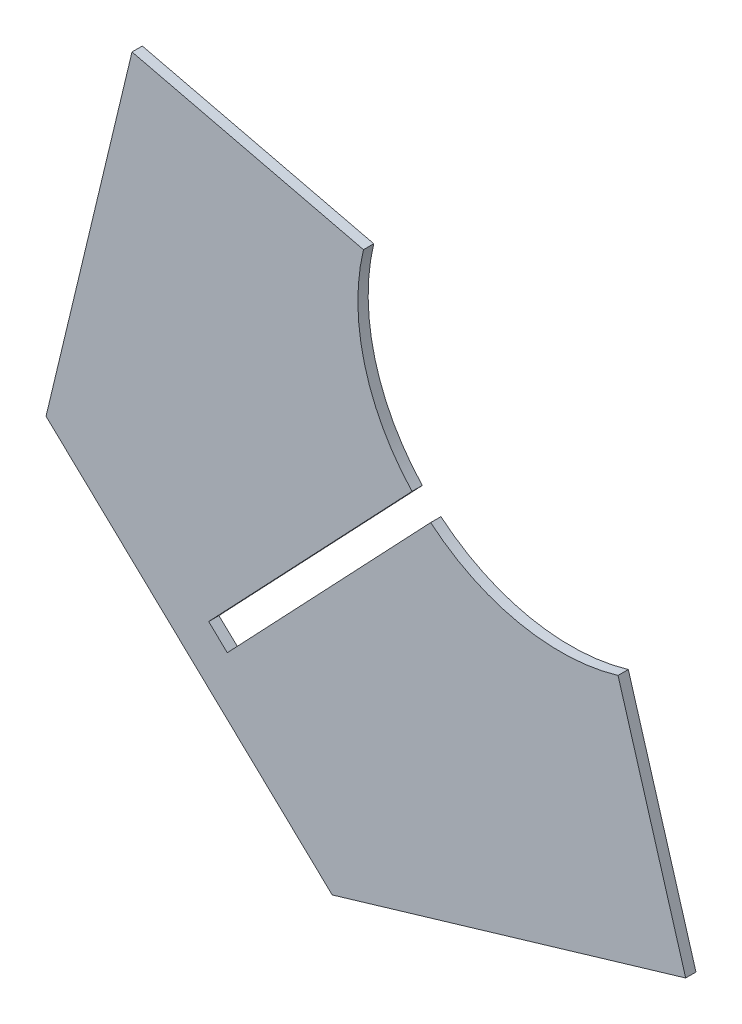
ISO-10303-21;
HEADER;
FILE_DESCRIPTION(('STEP AP214'),'2;1');
FILE_NAME('part.step','',(''),(''),'','','');
FILE_SCHEMA(('AUTOMOTIVE_DESIGN { 1 0 10303 214 1 1 1 1 }'));
ENDSEC;
DATA;
#1=APPLICATION_CONTEXT('core data for automotive mechanical design processes');
#2=APPLICATION_PROTOCOL_DEFINITION('international standard','automotive_design',2000,#1);
#3=PRODUCT_CONTEXT('',#1,'mechanical');
#4=PRODUCT('Part','Part','',(#3));
#5=PRODUCT_RELATED_PRODUCT_CATEGORY('part','',(#4));
#6=PRODUCT_DEFINITION_FORMATION('','',#4);
#7=PRODUCT_DEFINITION_CONTEXT('part definition',#1,'design');
#8=PRODUCT_DEFINITION('design','',#6,#7);
#9=PRODUCT_DEFINITION_SHAPE('','',#8);
#10=(LENGTH_UNIT() NAMED_UNIT(*) SI_UNIT(.MILLI.,.METRE.));
#11=(NAMED_UNIT(*) PLANE_ANGLE_UNIT() SI_UNIT($,.RADIAN.));
#12=(NAMED_UNIT(*) SI_UNIT($,.STERADIAN.) SOLID_ANGLE_UNIT());
#13=UNCERTAINTY_MEASURE_WITH_UNIT(LENGTH_MEASURE(1.E-05),#10,'distance_accuracy_value','');
#14=(GEOMETRIC_REPRESENTATION_CONTEXT(3) GLOBAL_UNCERTAINTY_ASSIGNED_CONTEXT((#13)) GLOBAL_UNIT_ASSIGNED_CONTEXT((#10,
#11,#12)) REPRESENTATION_CONTEXT('',''));
#15=CARTESIAN_POINT('',(0.,0.,0.));
#16=DIRECTION('',(0.,0.,1.));
#17=DIRECTION('',(1.,0.,0.));
#18=AXIS2_PLACEMENT_3D('',#15,#16,#17);
#19=CARTESIAN_POINT('',(-0.219099818656127,-0.230998005209927,-4.));
#20=DIRECTION('',(0.,0.,1.));
#21=DIRECTION('',(1.,0.,0.));
#22=AXIS2_PLACEMENT_3D('',#19,#20,#21);
#23=CYLINDRICAL_SURFACE('',#22,78.8403296338645);
#24=CARTESIAN_POINT('',(-0.219099818656127,-0.230998005209927,0.));
#25=DIRECTION('',(0.,0.,-1.));
#26=DIRECTION('',(-1.,0.,0.));
#27=AXIS2_PLACEMENT_3D('',#24,#25,#26);
#28=CIRCLE('',#27,78.8403296338645);
#29=CARTESIAN_POINT('',(22.1915535452838,-75.8190935796967,0.));
#30=VERTEX_POINT('',#29);
#31=CARTESIAN_POINT('',(-50.7380380628692,-60.7589622486388,0.));
#32=VERTEX_POINT('',#31);
#33=EDGE_CURVE('E143',#30,#32,#28,.T.);
#34=ORIENTED_EDGE('',*,*,#33,.F.);
#35=DIRECTION('',(0.,0.,1.));
#36=VECTOR('',#35,1.);
#37=CARTESIAN_POINT('',(22.1915535452838,-75.8190935796967,-4.));
#38=LINE('',#37,#36);
#39=CARTESIAN_POINT('',(22.1915535452838,-75.8190935796967,-4.));
#40=VERTEX_POINT('',#39);
#41=EDGE_CURVE('E11',#40,#30,#38,.T.);
#42=ORIENTED_EDGE('',*,*,#41,.F.);
#43=CARTESIAN_POINT('',(-0.219099818656127,-0.230998005209927,-4.));
#44=DIRECTION('',(0.,0.,-1.));
#45=DIRECTION('',(-1.,0.,0.));
#46=AXIS2_PLACEMENT_3D('',#43,#44,#45);
#47=CIRCLE('',#46,78.8403296338645);
#48=CARTESIAN_POINT('',(-50.7380380628692,-60.7589622486388,-4.));
#49=VERTEX_POINT('',#48);
#50=EDGE_CURVE('E164',#40,#49,#47,.T.);
#51=ORIENTED_EDGE('',*,*,#50,.T.);
#52=DIRECTION('',(0.,0.,1.));
#53=VECTOR('',#52,1.);
#54=CARTESIAN_POINT('',(-50.7380380628692,-60.7589622486388,-4.));
#55=LINE('',#54,#53);
#56=EDGE_CURVE('E37',#49,#32,#55,.T.);
#57=ORIENTED_EDGE('',*,*,#56,.T.);
#58=EDGE_LOOP('',(#34,#42,#51,#57));
#59=FACE_BOUND('',#58,.T.);
#60=ADVANCED_FACE('F34',(#59),#23,.F.);
#61=CARTESIAN_POINT('',(22.1915535452838,-75.8190935796967,-4.));
#62=DIRECTION('',(0.958749106269834,0.284253674077916,0.));
#63=DIRECTION('',(-0.284253674077916,0.958749106269834,0.));
#64=AXIS2_PLACEMENT_3D('',#61,#62,#63);
#65=PLANE('',#64);
#66=DIRECTION('',(-0.284253674077916,0.958749106269834,0.));
#67=VECTOR('',#66,1.);
#68=CARTESIAN_POINT('',(22.1915535452838,-75.8190935796967,0.));
#69=LINE('',#68,#67);
#70=CARTESIAN_POINT('',(48.52273894971,-164.630612218499,0.));
#71=VERTEX_POINT('',#70);
#72=EDGE_CURVE('E162',#71,#30,#69,.T.);
#73=ORIENTED_EDGE('',*,*,#72,.F.);
#74=DIRECTION('',(0.,0.,1.));
#75=VECTOR('',#74,1.);
#76=CARTESIAN_POINT('',(48.52273894971,-164.630612218499,-4.));
#77=LINE('',#76,#75);
#78=CARTESIAN_POINT('',(48.52273894971,-164.630612218499,-4.));
#79=VERTEX_POINT('',#78);
#80=EDGE_CURVE('E42',#79,#71,#77,.T.);
#81=ORIENTED_EDGE('',*,*,#80,.F.);
#82=DIRECTION('',(-0.284253674077916,0.958749106269834,0.));
#83=VECTOR('',#82,1.);
#84=CARTESIAN_POINT('',(22.1915535452838,-75.8190935796967,-4.));
#85=LINE('',#84,#83);
#86=EDGE_CURVE('E141',#79,#40,#85,.T.);
#87=ORIENTED_EDGE('',*,*,#86,.T.);
#88=ORIENTED_EDGE('',*,*,#41,.T.);
#89=EDGE_LOOP('',(#73,#81,#87,#88));
#90=FACE_BOUND('',#89,.T.);
#91=ADVANCED_FACE('F180',(#90),#65,.T.);
#92=CARTESIAN_POINT('',(-252.479191453199,-50.4016684066715,-4.));
#93=DIRECTION('',(-0.688174244846349,-0.72554545600545,0.));
#94=DIRECTION('',(0.72554545600545,-0.688174244846349,0.));
#95=AXIS2_PLACEMENT_3D('',#92,#93,#94);
#96=PLANE('',#95);
#97=DIRECTION('',(0.,0.,1.));
#98=VECTOR('',#97,1.);
#99=CARTESIAN_POINT('',(-89.0454024574619,-205.417351288536,-10.));
#100=LINE('',#99,#98);
#101=CARTESIAN_POINT('',(-89.0454024574619,-205.417351288536,-4.));
#102=VERTEX_POINT('',#101);
#103=CARTESIAN_POINT('',(-89.0454024574619,-205.417351288536,0.));
#104=VERTEX_POINT('',#103);
#105=EDGE_CURVE('E197',#102,#104,#100,.T.);
#106=ORIENTED_EDGE('',*,*,#105,.T.);
#107=DIRECTION('',(0.72554545600545,-0.688174244846349,0.));
#108=VECTOR('',#107,1.);
#109=CARTESIAN_POINT('',(-252.479191453199,-50.4016684066715,0.));
#110=LINE('',#109,#108);
#111=CARTESIAN_POINT('',(-200.425980015317,-99.7737362441728,0.));
#112=VERTEX_POINT('',#111);
#113=EDGE_CURVE('E159',#112,#104,#110,.T.);
#114=ORIENTED_EDGE('',*,*,#113,.F.);
#115=DIRECTION('',(0.,0.,1.));
#116=VECTOR('',#115,1.);
#117=CARTESIAN_POINT('',(-200.425980015317,-99.7737362441729,-10.));
#118=LINE('',#117,#116);
#119=CARTESIAN_POINT('',(-200.425980015317,-99.7737362441729,-4.));
#120=VERTEX_POINT('',#119);
#121=EDGE_CURVE('E50',#120,#112,#118,.T.);
#122=ORIENTED_EDGE('',*,*,#121,.F.);
#123=DIRECTION('',(0.72554545600545,-0.688174244846349,0.));
#124=VECTOR('',#123,1.);
#125=CARTESIAN_POINT('',(-252.479191453199,-50.4016684066715,-4.));
#126=LINE('',#125,#124);
#127=EDGE_CURVE('E138',#120,#102,#126,.T.);
#128=ORIENTED_EDGE('',*,*,#127,.T.);
#129=EDGE_LOOP('',(#106,#114,#122,#128));
#130=FACE_BOUND('',#129,.T.);
#131=ADVANCED_FACE('F205',(#130),#96,.T.);
#132=CARTESIAN_POINT('',(-76.8856374918177,18.1548546534546,-4.));
#133=DIRECTION('',(0.233203650264384,0.97242791892426,0.));
#134=DIRECTION('',(-0.97242791892426,0.233203650264384,0.));
#135=AXIS2_PLACEMENT_3D('',#132,#133,#134);
#136=PLANE('',#135);
#137=DIRECTION('',(-0.97242791892426,0.233203650264384,0.));
#138=VECTOR('',#137,1.);
#139=CARTESIAN_POINT('',(-76.8856374918177,18.1548546534546,0.));
#140=LINE('',#139,#138);
#141=CARTESIAN_POINT('',(-76.8856374918177,18.1548546534546,0.));
#142=VERTEX_POINT('',#141);
#143=CARTESIAN_POINT('',(-166.96426148391,39.7571385008654,0.));
#144=VERTEX_POINT('',#143);
#145=EDGE_CURVE('E156',#142,#144,#140,.T.);
#146=ORIENTED_EDGE('',*,*,#145,.F.);
#147=DIRECTION('',(0.,0.,1.));
#148=VECTOR('',#147,1.);
#149=CARTESIAN_POINT('',(-76.8856374918177,18.1548546534546,-4.));
#150=LINE('',#149,#148);
#151=CARTESIAN_POINT('',(-76.8856374918177,18.1548546534546,-4.));
#152=VERTEX_POINT('',#151);
#153=EDGE_CURVE('E115',#152,#142,#150,.T.);
#154=ORIENTED_EDGE('',*,*,#153,.F.);
#155=DIRECTION('',(-0.97242791892426,0.233203650264384,0.));
#156=VECTOR('',#155,1.);
#157=CARTESIAN_POINT('',(-76.8856374918177,18.1548546534546,-4.));
#158=LINE('',#157,#156);
#159=CARTESIAN_POINT('',(-166.96426148391,39.7571385008654,-4.));
#160=VERTEX_POINT('',#159);
#161=EDGE_CURVE('E128',#152,#160,#158,.T.);
#162=ORIENTED_EDGE('',*,*,#161,.T.);
#163=DIRECTION('',(0.,0.,1.));
#164=VECTOR('',#163,1.);
#165=CARTESIAN_POINT('',(-166.96426148391,39.7571385008654,-4.));
#166=LINE('',#165,#164);
#167=EDGE_CURVE('E167',#160,#144,#166,.T.);
#168=ORIENTED_EDGE('',*,*,#167,.T.);
#169=EDGE_LOOP('',(#146,#154,#162,#168));
#170=FACE_BOUND('',#169,.T.);
#171=ADVANCED_FACE('F213',(#170),#136,.T.);
#172=CARTESIAN_POINT('',(-0.219099818656127,-0.230998005209927,-4.));
#173=DIRECTION('',(0.,0.,1.));
#174=DIRECTION('',(1.,0.,0.));
#175=AXIS2_PLACEMENT_3D('',#172,#173,#174);
#176=CYLINDRICAL_SURFACE('',#175,78.8403296338645);
#177=CARTESIAN_POINT('',(-0.219099818656127,-0.230998005209927,0.));
#178=DIRECTION('',(0.,0.,-1.));
#179=DIRECTION('',(1.,0.,0.));
#180=AXIS2_PLACEMENT_3D('',#177,#178,#179);
#181=CIRCLE('',#180,78.8403296338645);
#182=CARTESIAN_POINT('',(-57.9934926229238,-53.8772198001752,0.));
#183=VERTEX_POINT('',#182);
#184=EDGE_CURVE('E110',#183,#142,#181,.T.);
#185=ORIENTED_EDGE('',*,*,#184,.F.);
#186=DIRECTION('',(0.,0.,1.));
#187=VECTOR('',#186,1.);
#188=CARTESIAN_POINT('',(-57.9934926229238,-53.8772198001752,-4.));
#189=LINE('',#188,#187);
#190=CARTESIAN_POINT('',(-57.9934926229238,-53.8772198001752,-4.));
#191=VERTEX_POINT('',#190);
#192=EDGE_CURVE('E105',#191,#183,#189,.T.);
#193=ORIENTED_EDGE('',*,*,#192,.F.);
#194=CARTESIAN_POINT('',(-0.219099818656127,-0.230998005209927,-4.));
#195=DIRECTION('',(0.,0.,-1.));
#196=DIRECTION('',(1.,0.,0.));
#197=AXIS2_PLACEMENT_3D('',#194,#195,#196);
#198=CIRCLE('',#197,78.8403296338645);
#199=EDGE_CURVE('E108',#191,#152,#198,.T.);
#200=ORIENTED_EDGE('',*,*,#199,.T.);
#201=ORIENTED_EDGE('',*,*,#153,.T.);
#202=EDGE_LOOP('',(#185,#193,#200,#201));
#203=FACE_BOUND('',#202,.T.);
#204=ADVANCED_FACE('F107',(#203),#176,.F.);
#205=CARTESIAN_POINT('',(-137.133530780254,-137.314947240802,-4.));
#206=DIRECTION('',(0.725545456005449,-0.688174244846351,0.));
#207=DIRECTION('',(0.688174244846351,0.725545456005449,0.));
#208=AXIS2_PLACEMENT_3D('',#205,#206,#207);
#209=PLANE('',#208);
#210=DIRECTION('',(0.688174244846351,0.725545456005449,0.));
#211=VECTOR('',#210,1.);
#212=CARTESIAN_POINT('',(-137.133530780254,-137.314947240802,0.));
#213=LINE('',#212,#211);
#214=CARTESIAN_POINT('',(-137.133530780254,-137.314947240802,0.));
#215=VERTEX_POINT('',#214);
#216=EDGE_CURVE('E153',#215,#183,#213,.T.);
#217=ORIENTED_EDGE('',*,*,#216,.F.);
#218=DIRECTION('',(0.,0.,1.));
#219=VECTOR('',#218,1.);
#220=CARTESIAN_POINT('',(-137.133530780254,-137.314947240802,-4.));
#221=LINE('',#220,#219);
#222=CARTESIAN_POINT('',(-137.133530780254,-137.314947240802,-4.));
#223=VERTEX_POINT('',#222);
#224=EDGE_CURVE('E116',#223,#215,#221,.T.);
#225=ORIENTED_EDGE('',*,*,#224,.F.);
#226=DIRECTION('',(0.688174244846351,0.725545456005449,0.));
#227=VECTOR('',#226,1.);
#228=CARTESIAN_POINT('',(-137.133530780254,-137.314947240802,-4.));
#229=LINE('',#228,#227);
#230=EDGE_CURVE('E124',#223,#191,#229,.T.);
#231=ORIENTED_EDGE('',*,*,#230,.T.);
#232=ORIENTED_EDGE('',*,*,#192,.T.);
#233=EDGE_LOOP('',(#217,#225,#231,#232));
#234=FACE_BOUND('',#233,.T.);
#235=ADVANCED_FACE('F130',(#234),#209,.T.);
#236=CARTESIAN_POINT('',(-129.8780762202,-144.196689689265,-4.));
#237=DIRECTION('',(0.688174244846351,0.725545456005449,0.));
#238=DIRECTION('',(-0.725545456005449,0.688174244846351,0.));
#239=AXIS2_PLACEMENT_3D('',#236,#237,#238);
#240=PLANE('',#239);
#241=DIRECTION('',(-0.725545456005449,0.688174244846351,0.));
#242=VECTOR('',#241,1.);
#243=CARTESIAN_POINT('',(-129.8780762202,-144.196689689265,0.));
#244=LINE('',#243,#242);
#245=CARTESIAN_POINT('',(-129.8780762202,-144.196689689265,0.));
#246=VERTEX_POINT('',#245);
#247=EDGE_CURVE('E150',#246,#215,#244,.T.);
#248=ORIENTED_EDGE('',*,*,#247,.F.);
#249=DIRECTION('',(0.,0.,1.));
#250=VECTOR('',#249,1.);
#251=CARTESIAN_POINT('',(-129.8780762202,-144.196689689265,-4.));
#252=LINE('',#251,#250);
#253=CARTESIAN_POINT('',(-129.8780762202,-144.196689689265,-4.));
#254=VERTEX_POINT('',#253);
#255=EDGE_CURVE('E171',#254,#246,#252,.T.);
#256=ORIENTED_EDGE('',*,*,#255,.F.);
#257=DIRECTION('',(-0.725545456005449,0.688174244846351,0.));
#258=VECTOR('',#257,1.);
#259=CARTESIAN_POINT('',(-129.8780762202,-144.196689689265,-4.));
#260=LINE('',#259,#258);
#261=EDGE_CURVE('E131',#254,#223,#260,.T.);
#262=ORIENTED_EDGE('',*,*,#261,.T.);
#263=ORIENTED_EDGE('',*,*,#224,.T.);
#264=EDGE_LOOP('',(#248,#256,#262,#263));
#265=FACE_BOUND('',#264,.T.);
#266=ADVANCED_FACE('F216',(#265),#240,.T.);
#267=CARTESIAN_POINT('',(-129.8780762202,-144.196689689265,-4.));
#268=DIRECTION('',(-0.725545456005448,0.688174244846352,0.));
#269=DIRECTION('',(-0.688174244846352,-0.725545456005448,0.));
#270=AXIS2_PLACEMENT_3D('',#267,#268,#269);
#271=PLANE('',#270);
#272=DIRECTION('',(-0.688174244846352,-0.725545456005448,0.));
#273=VECTOR('',#272,1.);
#274=CARTESIAN_POINT('',(-129.8780762202,-144.196689689265,0.));
#275=LINE('',#274,#273);
#276=EDGE_CURVE('E146',#32,#246,#275,.T.);
#277=ORIENTED_EDGE('',*,*,#276,.F.);
#278=ORIENTED_EDGE('',*,*,#56,.F.);
#279=DIRECTION('',(-0.688174244846352,-0.725545456005448,0.));
#280=VECTOR('',#279,1.);
#281=CARTESIAN_POINT('',(-129.8780762202,-144.196689689265,-4.));
#282=LINE('',#281,#280);
#283=EDGE_CURVE('E133',#49,#254,#282,.T.);
#284=ORIENTED_EDGE('',*,*,#283,.T.);
#285=ORIENTED_EDGE('',*,*,#255,.T.);
#286=EDGE_LOOP('',(#277,#278,#284,#285));
#287=FACE_BOUND('',#286,.T.);
#288=ADVANCED_FACE('F173',(#287),#271,.T.);
#289=CARTESIAN_POINT('',(-0.219099818656127,-0.230998005209927,-4.));
#290=DIRECTION('',(0.,0.,-1.));
#291=DIRECTION('',(-1.,0.,0.));
#292=AXIS2_PLACEMENT_3D('',#289,#290,#291);
#293=PLANE('',#292);
#294=DIRECTION('',(0.958749106269834,0.284253674077916,0.));
#295=VECTOR('',#294,1.);
#296=CARTESIAN_POINT('',(48.5227389497101,-164.630612218499,-4.));
#297=LINE('',#296,#295);
#298=EDGE_CURVE('E189',#102,#79,#297,.T.);
#299=ORIENTED_EDGE('',*,*,#298,.F.);
#300=ORIENTED_EDGE('',*,*,#127,.F.);
#301=DIRECTION('',(-0.233203650264384,-0.97242791892426,0.));
#302=VECTOR('',#301,1.);
#303=CARTESIAN_POINT('',(-166.96426148391,39.7571385008654,-4.));
#304=LINE('',#303,#302);
#305=EDGE_CURVE('E147',#160,#120,#304,.T.);
#306=ORIENTED_EDGE('',*,*,#305,.F.);
#307=ORIENTED_EDGE('',*,*,#161,.F.);
#308=ORIENTED_EDGE('',*,*,#199,.F.);
#309=ORIENTED_EDGE('',*,*,#230,.F.);
#310=ORIENTED_EDGE('',*,*,#261,.F.);
#311=ORIENTED_EDGE('',*,*,#283,.F.);
#312=ORIENTED_EDGE('',*,*,#50,.F.);
#313=ORIENTED_EDGE('',*,*,#86,.F.);
#314=EDGE_LOOP('',(#299,#300,#306,#307,#308,#309,#310,#311,#312,#313));
#315=FACE_BOUND('',#314,.T.);
#316=ADVANCED_FACE('F122',(#315),#293,.T.);
#317=CARTESIAN_POINT('',(-0.219099818656127,-0.230998005209927,0.));
#318=DIRECTION('',(0.,0.,-1.));
#319=DIRECTION('',(-1.,0.,0.));
#320=AXIS2_PLACEMENT_3D('',#317,#318,#319);
#321=PLANE('',#320);
#322=ORIENTED_EDGE('',*,*,#113,.T.);
#323=DIRECTION('',(-0.958749106269834,-0.284253674077916,0.));
#324=VECTOR('',#323,1.);
#325=CARTESIAN_POINT('',(48.52273894971,-164.630612218499,0.));
#326=LINE('',#325,#324);
#327=EDGE_CURVE('E178',#71,#104,#326,.T.);
#328=ORIENTED_EDGE('',*,*,#327,.F.);
#329=ORIENTED_EDGE('',*,*,#72,.T.);
#330=ORIENTED_EDGE('',*,*,#33,.T.);
#331=ORIENTED_EDGE('',*,*,#276,.T.);
#332=ORIENTED_EDGE('',*,*,#247,.T.);
#333=ORIENTED_EDGE('',*,*,#216,.T.);
#334=ORIENTED_EDGE('',*,*,#184,.T.);
#335=ORIENTED_EDGE('',*,*,#145,.T.);
#336=DIRECTION('',(0.233203650264384,0.97242791892426,0.));
#337=VECTOR('',#336,1.);
#338=CARTESIAN_POINT('',(-166.96426148391,39.7571385008654,0.));
#339=LINE('',#338,#337);
#340=EDGE_CURVE('E194',#112,#144,#339,.T.);
#341=ORIENTED_EDGE('',*,*,#340,.F.);
#342=EDGE_LOOP('',(#322,#328,#329,#330,#331,#332,#333,#334,#335,#341));
#343=FACE_BOUND('',#342,.T.);
#344=ADVANCED_FACE('F175',(#343),#321,.F.);
#345=CARTESIAN_POINT('',(-166.96426148391,39.7571385008654,-10.));
#346=DIRECTION('',(0.97242791892426,-0.233203650264384,0.));
#347=DIRECTION('',(0.233203650264384,0.97242791892426,0.));
#348=AXIS2_PLACEMENT_3D('',#345,#346,#347);
#349=PLANE('',#348);
#350=ORIENTED_EDGE('',*,*,#305,.T.);
#351=ORIENTED_EDGE('',*,*,#121,.T.);
#352=ORIENTED_EDGE('',*,*,#340,.T.);
#353=ORIENTED_EDGE('',*,*,#167,.F.);
#354=EDGE_LOOP('',(#350,#351,#352,#353));
#355=FACE_BOUND('',#354,.T.);
#356=ADVANCED_FACE('F209',(#355),#349,.F.);
#357=CARTESIAN_POINT('',(48.52273894971,-164.630612218499,-10.));
#358=DIRECTION('',(-0.284253674077916,0.958749106269834,0.));
#359=DIRECTION('',(-0.958749106269834,-0.284253674077916,0.));
#360=AXIS2_PLACEMENT_3D('',#357,#358,#359);
#361=PLANE('',#360);
#362=ORIENTED_EDGE('',*,*,#298,.T.);
#363=ORIENTED_EDGE('',*,*,#80,.T.);
#364=ORIENTED_EDGE('',*,*,#327,.T.);
#365=ORIENTED_EDGE('',*,*,#105,.F.);
#366=EDGE_LOOP('',(#362,#363,#364,#365));
#367=FACE_BOUND('',#366,.T.);
#368=ADVANCED_FACE('F201',(#367),#361,.F.);
#369=CLOSED_SHELL('',(#60,#91,#131,#171,#204,#235,#266,#288,#316,#344,#356,#368));
#370=MANIFOLD_SOLID_BREP('B2',#369);
#371=ADVANCED_BREP_SHAPE_REPRESENTATION('',(#18,#370),#14);
#372=SHAPE_DEFINITION_REPRESENTATION(#9,#371);
ENDSEC;
END-ISO-10303-21;
